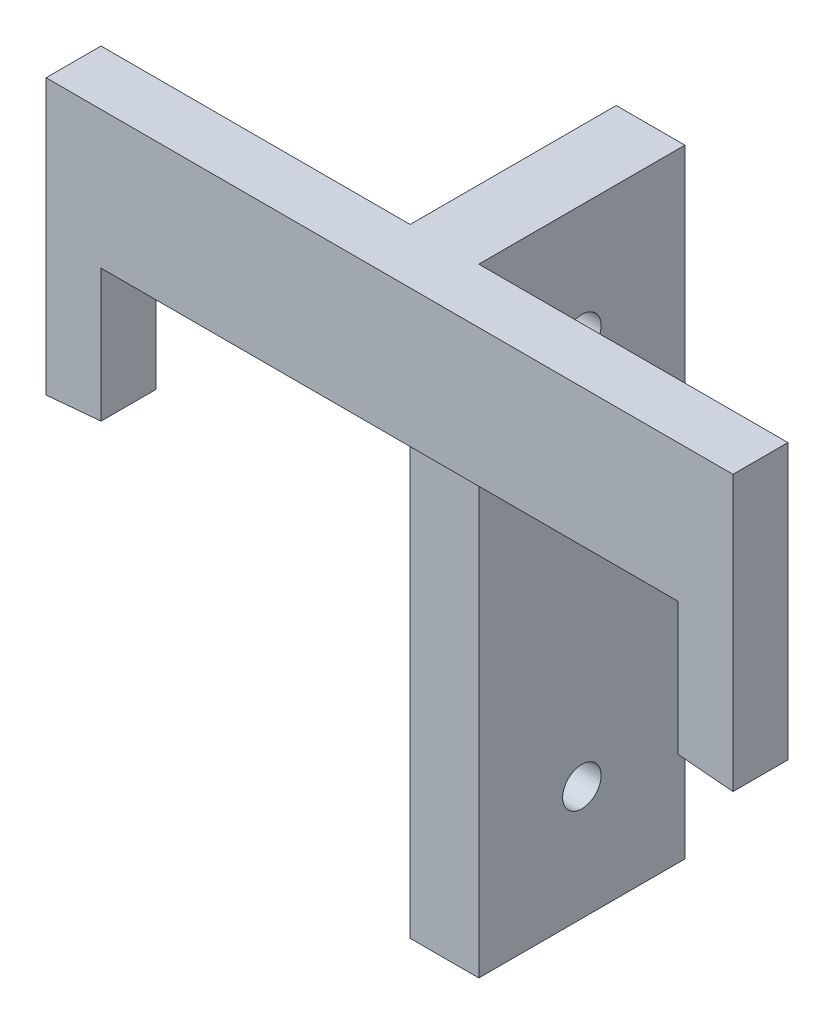
ISO-10303-21;
HEADER;
FILE_DESCRIPTION(('STEP AP214'),'2;1');
FILE_NAME('part.step','',(''),(''),'','','');
FILE_SCHEMA(('AUTOMOTIVE_DESIGN { 1 0 10303 214 1 1 1 1 }'));
ENDSEC;
DATA;
#1=APPLICATION_CONTEXT('core data for automotive mechanical design processes');
#2=APPLICATION_PROTOCOL_DEFINITION('international standard','automotive_design',2000,#1);
#3=PRODUCT_CONTEXT('',#1,'mechanical');
#4=PRODUCT('Part','Part','',(#3));
#5=PRODUCT_RELATED_PRODUCT_CATEGORY('part','',(#4));
#6=PRODUCT_DEFINITION_FORMATION('','',#4);
#7=PRODUCT_DEFINITION_CONTEXT('part definition',#1,'design');
#8=PRODUCT_DEFINITION('design','',#6,#7);
#9=PRODUCT_DEFINITION_SHAPE('','',#8);
#10=(LENGTH_UNIT() NAMED_UNIT(*) SI_UNIT(.MILLI.,.METRE.));
#11=(NAMED_UNIT(*) PLANE_ANGLE_UNIT() SI_UNIT($,.RADIAN.));
#12=(NAMED_UNIT(*) SI_UNIT($,.STERADIAN.) SOLID_ANGLE_UNIT());
#13=UNCERTAINTY_MEASURE_WITH_UNIT(LENGTH_MEASURE(1.E-05),#10,'distance_accuracy_value','');
#14=(GEOMETRIC_REPRESENTATION_CONTEXT(3) GLOBAL_UNCERTAINTY_ASSIGNED_CONTEXT((#13)) GLOBAL_UNIT_ASSIGNED_CONTEXT((#10,
#11,#12)) REPRESENTATION_CONTEXT('',''));
#15=CARTESIAN_POINT('',(0.,0.,0.));
#16=DIRECTION('',(0.,0.,1.));
#17=DIRECTION('',(1.,0.,0.));
#18=AXIS2_PLACEMENT_3D('',#15,#16,#17);
#19=CARTESIAN_POINT('',(1.5875,-14.2875,9.525));
#20=DIRECTION('',(-1.,0.,0.));
#21=DIRECTION('',(0.,0.,1.));
#22=AXIS2_PLACEMENT_3D('',#19,#20,#21);
#23=PLANE('',#22);
#24=CARTESIAN_POINT('',(1.5875,-9.0043,4.7625));
#25=DIRECTION('',(1.,0.,0.));
#26=DIRECTION('',(0.,0.,-1.));
#27=AXIS2_PLACEMENT_3D('',#24,#25,#26);
#28=CIRCLE('',#27,0.889);
#29=CARTESIAN_POINT('',(1.5875,-9.0043,3.8735));
#30=VERTEX_POINT('',#29);
#31=EDGE_CURVE('E108',#30,#30,#28,.T.);
#32=ORIENTED_EDGE('',*,*,#31,.F.);
#33=EDGE_LOOP('',(#32));
#34=FACE_BOUND('',#33,.T.);
#35=CARTESIAN_POINT('',(1.5875,9.0043,4.7625));
#36=DIRECTION('',(1.,0.,0.));
#37=DIRECTION('',(0.,0.,1.));
#38=AXIS2_PLACEMENT_3D('',#35,#36,#37);
#39=CIRCLE('',#38,0.889);
#40=CARTESIAN_POINT('',(1.5875,9.0043,5.6515));
#41=VERTEX_POINT('',#40);
#42=EDGE_CURVE('E184',#41,#41,#39,.T.);
#43=ORIENTED_EDGE('',*,*,#42,.F.);
#44=EDGE_LOOP('',(#43));
#45=FACE_BOUND('',#44,.T.);
#46=DIRECTION('',(0.,1.,0.));
#47=VECTOR('',#46,1.);
#48=CARTESIAN_POINT('',(1.5875,-14.2875,0.));
#49=LINE('',#48,#47);
#50=CARTESIAN_POINT('',(1.5875,-14.2875,0.));
#51=VERTEX_POINT('',#50);
#52=CARTESIAN_POINT('',(1.5875,14.2875,0.));
#53=VERTEX_POINT('',#52);
#54=EDGE_CURVE('E97',#51,#53,#49,.T.);
#55=ORIENTED_EDGE('',*,*,#54,.T.);
#56=DIRECTION('',(0.,0.,-1.));
#57=VECTOR('',#56,1.);
#58=CARTESIAN_POINT('',(1.5875,14.2875,9.525));
#59=LINE('',#58,#57);
#60=CARTESIAN_POINT('',(1.5875,14.2875,9.525));
#61=VERTEX_POINT('',#60);
#62=EDGE_CURVE('E40',#61,#53,#59,.T.);
#63=ORIENTED_EDGE('',*,*,#62,.F.);
#64=DIRECTION('',(0.,1.,0.));
#65=VECTOR('',#64,1.);
#66=CARTESIAN_POINT('',(1.5875,-14.2875,9.525));
#67=LINE('',#66,#65);
#68=CARTESIAN_POINT('',(1.5875,7.9375,9.525));
#69=VERTEX_POINT('',#68);
#70=EDGE_CURVE('E91',#69,#61,#67,.T.);
#71=ORIENTED_EDGE('',*,*,#70,.F.);
#72=CARTESIAN_POINT('',(1.5875,-14.2875,9.525));
#73=VERTEX_POINT('',#72);
#74=EDGE_CURVE('E99',#73,#69,#67,.T.);
#75=ORIENTED_EDGE('',*,*,#74,.F.);
#76=DIRECTION('',(0.,0.,-1.));
#77=VECTOR('',#76,1.);
#78=CARTESIAN_POINT('',(1.5875,-14.2875,9.525));
#79=LINE('',#78,#77);
#80=EDGE_CURVE('E84',#73,#51,#79,.T.);
#81=ORIENTED_EDGE('',*,*,#80,.T.);
#82=EDGE_LOOP('',(#55,#63,#71,#75,#81));
#83=FACE_BOUND('',#82,.T.);
#84=ADVANCED_FACE('F37',(#34,#45,#83),#23,.F.);
#85=CARTESIAN_POINT('',(-1.5875,14.2875,9.525));
#86=DIRECTION('',(0.,-1.,0.));
#87=DIRECTION('',(0.,0.,-1.));
#88=AXIS2_PLACEMENT_3D('',#85,#86,#87);
#89=PLANE('',#88);
#90=DIRECTION('',(-1.,0.,0.));
#91=VECTOR('',#90,1.);
#92=CARTESIAN_POINT('',(-1.5875,14.2875,0.));
#93=LINE('',#92,#91);
#94=CARTESIAN_POINT('',(-1.5875,14.2875,0.));
#95=VERTEX_POINT('',#94);
#96=EDGE_CURVE('E102',#53,#95,#93,.T.);
#97=ORIENTED_EDGE('',*,*,#96,.T.);
#98=DIRECTION('',(0.,0.,-1.));
#99=VECTOR('',#98,1.);
#100=CARTESIAN_POINT('',(-1.5875,14.2875,9.525));
#101=LINE('',#100,#99);
#102=CARTESIAN_POINT('',(-1.5875,14.2875,9.525));
#103=VERTEX_POINT('',#102);
#104=EDGE_CURVE('E114',#103,#95,#101,.T.);
#105=ORIENTED_EDGE('',*,*,#104,.F.);
#106=DIRECTION('',(-1.,0.,0.));
#107=VECTOR('',#106,1.);
#108=CARTESIAN_POINT('',(0.,14.2875,9.525));
#109=LINE('',#108,#107);
#110=CARTESIAN_POINT('',(-15.875,14.2875,9.525));
#111=VERTEX_POINT('',#110);
#112=EDGE_CURVE('E437',#103,#111,#109,.T.);
#113=ORIENTED_EDGE('',*,*,#112,.T.);
#114=DIRECTION('',(0.,0.,-1.));
#115=VECTOR('',#114,1.);
#116=CARTESIAN_POINT('',(-15.875,14.2875,12.065));
#117=LINE('',#116,#115);
#118=CARTESIAN_POINT('',(-15.875,14.2875,12.065));
#119=VERTEX_POINT('',#118);
#120=EDGE_CURVE('E181',#119,#111,#117,.T.);
#121=ORIENTED_EDGE('',*,*,#120,.F.);
#122=DIRECTION('',(-1.,0.,0.));
#123=VECTOR('',#122,1.);
#124=CARTESIAN_POINT('',(0.,14.2875,12.065));
#125=LINE('',#124,#123);
#126=CARTESIAN_POINT('',(15.875,14.2875,12.065));
#127=VERTEX_POINT('',#126);
#128=EDGE_CURVE('E160',#127,#119,#125,.T.);
#129=ORIENTED_EDGE('',*,*,#128,.F.);
#130=DIRECTION('',(0.,0.,-1.));
#131=VECTOR('',#130,1.);
#132=CARTESIAN_POINT('',(15.875,14.2875,12.065));
#133=LINE('',#132,#131);
#134=CARTESIAN_POINT('',(15.875,14.2875,9.525));
#135=VERTEX_POINT('',#134);
#136=EDGE_CURVE('E161',#127,#135,#133,.T.);
#137=ORIENTED_EDGE('',*,*,#136,.T.);
#138=EDGE_CURVE('E125',#135,#61,#109,.T.);
#139=ORIENTED_EDGE('',*,*,#138,.T.);
#140=ORIENTED_EDGE('',*,*,#62,.T.);
#141=EDGE_LOOP('',(#97,#105,#113,#121,#129,#137,#139,#140));
#142=FACE_BOUND('',#141,.T.);
#143=ADVANCED_FACE('F121',(#142),#89,.F.);
#144=CARTESIAN_POINT('',(-1.5875,-14.2875,9.525));
#145=DIRECTION('',(1.,0.,0.));
#146=DIRECTION('',(0.,0.,-1.));
#147=AXIS2_PLACEMENT_3D('',#144,#145,#146);
#148=PLANE('',#147);
#149=CARTESIAN_POINT('',(-1.5875,-9.0043,4.7625));
#150=DIRECTION('',(1.,0.,0.));
#151=DIRECTION('',(0.,0.,-1.));
#152=AXIS2_PLACEMENT_3D('',#149,#150,#151);
#153=CIRCLE('',#152,0.889);
#154=CARTESIAN_POINT('',(-1.5875,-9.0043,3.8735));
#155=VERTEX_POINT('',#154);
#156=EDGE_CURVE('E104',#155,#155,#153,.F.);
#157=ORIENTED_EDGE('',*,*,#156,.F.);
#158=EDGE_LOOP('',(#157));
#159=FACE_BOUND('',#158,.T.);
#160=CARTESIAN_POINT('',(-1.5875,9.0043,4.7625));
#161=DIRECTION('',(1.,0.,0.));
#162=DIRECTION('',(0.,0.,-1.));
#163=AXIS2_PLACEMENT_3D('',#160,#161,#162);
#164=CIRCLE('',#163,0.889);
#165=CARTESIAN_POINT('',(-1.5875,9.0043,3.8735));
#166=VERTEX_POINT('',#165);
#167=EDGE_CURVE('E186',#166,#166,#164,.F.);
#168=ORIENTED_EDGE('',*,*,#167,.F.);
#169=EDGE_LOOP('',(#168));
#170=FACE_BOUND('',#169,.T.);
#171=DIRECTION('',(0.,-1.,0.));
#172=VECTOR('',#171,1.);
#173=CARTESIAN_POINT('',(-1.5875,-14.2875,0.));
#174=LINE('',#173,#172);
#175=CARTESIAN_POINT('',(-1.5875,-14.2875,0.));
#176=VERTEX_POINT('',#175);
#177=EDGE_CURVE('E92',#95,#176,#174,.T.);
#178=ORIENTED_EDGE('',*,*,#177,.T.);
#179=DIRECTION('',(0.,0.,-1.));
#180=VECTOR('',#179,1.);
#181=CARTESIAN_POINT('',(-1.5875,-14.2875,9.525));
#182=LINE('',#181,#180);
#183=CARTESIAN_POINT('',(-1.5875,-14.2875,9.525));
#184=VERTEX_POINT('',#183);
#185=EDGE_CURVE('E87',#184,#176,#182,.T.);
#186=ORIENTED_EDGE('',*,*,#185,.F.);
#187=DIRECTION('',(0.,-1.,0.));
#188=VECTOR('',#187,1.);
#189=CARTESIAN_POINT('',(-1.5875,-14.2875,9.525));
#190=LINE('',#189,#188);
#191=CARTESIAN_POINT('',(-1.5875,7.9375,9.525));
#192=VERTEX_POINT('',#191);
#193=EDGE_CURVE('E192',#192,#184,#190,.T.);
#194=ORIENTED_EDGE('',*,*,#193,.F.);
#195=EDGE_CURVE('E193',#103,#192,#190,.T.);
#196=ORIENTED_EDGE('',*,*,#195,.F.);
#197=ORIENTED_EDGE('',*,*,#104,.T.);
#198=EDGE_LOOP('',(#178,#186,#194,#196,#197));
#199=FACE_BOUND('',#198,.T.);
#200=ADVANCED_FACE('F196',(#159,#170,#199),#148,.F.);
#201=CARTESIAN_POINT('',(-1.5875,-14.2875,9.525));
#202=DIRECTION('',(0.,1.,0.));
#203=DIRECTION('',(0.,0.,1.));
#204=AXIS2_PLACEMENT_3D('',#201,#202,#203);
#205=PLANE('',#204);
#206=DIRECTION('',(1.,0.,0.));
#207=VECTOR('',#206,1.);
#208=CARTESIAN_POINT('',(-1.5875,-14.2875,0.));
#209=LINE('',#208,#207);
#210=EDGE_CURVE('E81',#176,#51,#209,.T.);
#211=ORIENTED_EDGE('',*,*,#210,.T.);
#212=ORIENTED_EDGE('',*,*,#80,.F.);
#213=DIRECTION('',(1.,0.,0.));
#214=VECTOR('',#213,1.);
#215=CARTESIAN_POINT('',(-1.5875,-14.2875,9.525));
#216=LINE('',#215,#214);
#217=EDGE_CURVE('E62',#184,#73,#216,.T.);
#218=ORIENTED_EDGE('',*,*,#217,.F.);
#219=ORIENTED_EDGE('',*,*,#185,.T.);
#220=EDGE_LOOP('',(#211,#212,#218,#219));
#221=FACE_BOUND('',#220,.T.);
#222=ADVANCED_FACE('F83',(#221),#205,.F.);
#223=CARTESIAN_POINT('',(0.,0.,9.525));
#224=DIRECTION('',(0.,0.,-1.));
#225=DIRECTION('',(-1.,0.,0.));
#226=AXIS2_PLACEMENT_3D('',#223,#224,#225);
#227=PLANE('',#226);
#228=ORIENTED_EDGE('',*,*,#74,.T.);
#229=DIRECTION('',(-1.,0.,0.));
#230=VECTOR('',#229,1.);
#231=CARTESIAN_POINT('',(0.,7.9375,9.525));
#232=LINE('',#231,#230);
#233=EDGE_CURVE('E11',#69,#192,#232,.T.);
#234=ORIENTED_EDGE('',*,*,#233,.T.);
#235=ORIENTED_EDGE('',*,*,#193,.T.);
#236=ORIENTED_EDGE('',*,*,#217,.T.);
#237=EDGE_LOOP('',(#228,#234,#235,#236));
#238=FACE_BOUND('',#237,.T.);
#239=ADVANCED_FACE('F195',(#238),#227,.F.);
#240=CARTESIAN_POINT('',(0.,0.,0.));
#241=DIRECTION('',(0.,0.,-1.));
#242=DIRECTION('',(-1.,0.,0.));
#243=AXIS2_PLACEMENT_3D('',#240,#241,#242);
#244=PLANE('',#243);
#245=ORIENTED_EDGE('',*,*,#54,.F.);
#246=ORIENTED_EDGE('',*,*,#210,.F.);
#247=ORIENTED_EDGE('',*,*,#177,.F.);
#248=ORIENTED_EDGE('',*,*,#96,.F.);
#249=EDGE_LOOP('',(#245,#246,#247,#248));
#250=FACE_BOUND('',#249,.T.);
#251=ADVANCED_FACE('F101',(#250),#244,.T.);
#252=CARTESIAN_POINT('',(-1.5885,9.0043,4.7625));
#253=DIRECTION('',(1.,0.,0.));
#254=DIRECTION('',(0.,0.,-1.));
#255=AXIS2_PLACEMENT_3D('',#252,#253,#254);
#256=CYLINDRICAL_SURFACE('',#255,0.889);
#257=ORIENTED_EDGE('',*,*,#42,.T.);
#258=EDGE_LOOP('',(#257));
#259=FACE_BOUND('',#258,.T.);
#260=ORIENTED_EDGE('',*,*,#167,.T.);
#261=EDGE_LOOP('',(#260));
#262=FACE_BOUND('',#261,.T.);
#263=ADVANCED_FACE('F215',(#259,#262),#256,.F.);
#264=CARTESIAN_POINT('',(-1.5885,-9.0043,4.7625));
#265=DIRECTION('',(1.,0.,0.));
#266=DIRECTION('',(0.,0.,-1.));
#267=AXIS2_PLACEMENT_3D('',#264,#265,#266);
#268=CYLINDRICAL_SURFACE('',#267,0.889);
#269=ORIENTED_EDGE('',*,*,#31,.T.);
#270=EDGE_LOOP('',(#269));
#271=FACE_BOUND('',#270,.T.);
#272=ORIENTED_EDGE('',*,*,#156,.T.);
#273=EDGE_LOOP('',(#272));
#274=FACE_BOUND('',#273,.T.);
#275=ADVANCED_FACE('F218',(#271,#274),#268,.F.);
#276=CARTESIAN_POINT('',(0.,0.,9.525));
#277=DIRECTION('',(0.,0.,1.));
#278=DIRECTION('',(1.,0.,0.));
#279=AXIS2_PLACEMENT_3D('',#276,#277,#278);
#280=PLANE('',#279);
#281=CARTESIAN_POINT('',(13.335,7.9375,9.525));
#282=VERTEX_POINT('',#281);
#283=EDGE_CURVE('E46',#282,#69,#232,.T.);
#284=ORIENTED_EDGE('',*,*,#283,.T.);
#285=ORIENTED_EDGE('',*,*,#70,.T.);
#286=ORIENTED_EDGE('',*,*,#138,.F.);
#287=DIRECTION('',(0.,-1.,0.));
#288=VECTOR('',#287,1.);
#289=CARTESIAN_POINT('',(15.875,0.,9.525));
#290=LINE('',#289,#288);
#291=CARTESIAN_POINT('',(15.875,1.5875,9.525));
#292=VERTEX_POINT('',#291);
#293=EDGE_CURVE('E157',#135,#292,#290,.T.);
#294=ORIENTED_EDGE('',*,*,#293,.T.);
#295=DIRECTION('',(-0.996194698091745,0.087155742747662,0.));
#296=VECTOR('',#295,1.);
#297=CARTESIAN_POINT('',(0.258421701488741,2.95377356418476,9.525));
#298=LINE('',#297,#296);
#299=CARTESIAN_POINT('',(13.335,1.80972120535586,9.525));
#300=VERTEX_POINT('',#299);
#301=EDGE_CURVE('E150',#292,#300,#298,.T.);
#302=ORIENTED_EDGE('',*,*,#301,.T.);
#303=DIRECTION('',(0.,1.,0.));
#304=VECTOR('',#303,1.);
#305=CARTESIAN_POINT('',(13.335,0.,9.525));
#306=LINE('',#305,#304);
#307=EDGE_CURVE('E149',#300,#282,#306,.T.);
#308=ORIENTED_EDGE('',*,*,#307,.T.);
#309=EDGE_LOOP('',(#284,#285,#286,#294,#302,#308));
#310=FACE_BOUND('',#309,.T.);
#311=ADVANCED_FACE('F146',(#310),#280,.F.);
#312=ORIENTED_EDGE('',*,*,#112,.F.);
#313=ORIENTED_EDGE('',*,*,#195,.T.);
#314=CARTESIAN_POINT('',(-13.335,7.9375,9.525));
#315=VERTEX_POINT('',#314);
#316=EDGE_CURVE('E47',#192,#315,#232,.T.);
#317=ORIENTED_EDGE('',*,*,#316,.T.);
#318=DIRECTION('',(0.,1.,0.));
#319=VECTOR('',#318,1.);
#320=CARTESIAN_POINT('',(-13.335,0.,9.525));
#321=LINE('',#320,#319);
#322=CARTESIAN_POINT('',(-13.335,1.80972120535586,9.525));
#323=VERTEX_POINT('',#322);
#324=EDGE_CURVE('E152',#323,#315,#321,.T.);
#325=ORIENTED_EDGE('',*,*,#324,.F.);
#326=DIRECTION('',(0.996194698091745,0.087155742747662,0.));
#327=VECTOR('',#326,1.);
#328=CARTESIAN_POINT('',(-0.258421701488741,2.95377356418476,9.525));
#329=LINE('',#328,#327);
#330=CARTESIAN_POINT('',(-15.875,1.5875,9.525));
#331=VERTEX_POINT('',#330);
#332=EDGE_CURVE('E458',#331,#323,#329,.T.);
#333=ORIENTED_EDGE('',*,*,#332,.F.);
#334=DIRECTION('',(0.,-1.,0.));
#335=VECTOR('',#334,1.);
#336=CARTESIAN_POINT('',(-15.875,0.,9.525));
#337=LINE('',#336,#335);
#338=EDGE_CURVE('E441',#111,#331,#337,.T.);
#339=ORIENTED_EDGE('',*,*,#338,.F.);
#340=EDGE_LOOP('',(#312,#313,#317,#325,#333,#339));
#341=FACE_BOUND('',#340,.T.);
#342=ADVANCED_FACE('F285',(#341),#280,.F.);
#343=CARTESIAN_POINT('',(-15.875,0.,12.065));
#344=DIRECTION('',(1.,0.,0.));
#345=DIRECTION('',(0.,0.,-1.));
#346=AXIS2_PLACEMENT_3D('',#343,#344,#345);
#347=PLANE('',#346);
#348=ORIENTED_EDGE('',*,*,#338,.T.);
#349=DIRECTION('',(0.,0.,-1.));
#350=VECTOR('',#349,1.);
#351=CARTESIAN_POINT('',(-15.875,1.5875,12.065));
#352=LINE('',#351,#350);
#353=CARTESIAN_POINT('',(-15.875,1.5875,12.065));
#354=VERTEX_POINT('',#353);
#355=EDGE_CURVE('E178',#354,#331,#352,.T.);
#356=ORIENTED_EDGE('',*,*,#355,.F.);
#357=DIRECTION('',(0.,-1.,0.));
#358=VECTOR('',#357,1.);
#359=CARTESIAN_POINT('',(-15.875,0.,12.065));
#360=LINE('',#359,#358);
#361=EDGE_CURVE('E429',#119,#354,#360,.T.);
#362=ORIENTED_EDGE('',*,*,#361,.F.);
#363=ORIENTED_EDGE('',*,*,#120,.T.);
#364=EDGE_LOOP('',(#348,#356,#362,#363));
#365=FACE_BOUND('',#364,.T.);
#366=ADVANCED_FACE('F305',(#365),#347,.F.);
#367=CARTESIAN_POINT('',(-0.258421701488741,2.95377356418476,12.065));
#368=DIRECTION('',(-0.087155742747662,0.996194698091745,0.));
#369=DIRECTION('',(-0.996194698091745,-0.087155742747662,0.));
#370=AXIS2_PLACEMENT_3D('',#367,#368,#369);
#371=PLANE('',#370);
#372=ORIENTED_EDGE('',*,*,#332,.T.);
#373=DIRECTION('',(0.,0.,-1.));
#374=VECTOR('',#373,1.);
#375=CARTESIAN_POINT('',(-13.335,1.80972120535586,12.065));
#376=LINE('',#375,#374);
#377=CARTESIAN_POINT('',(-13.335,1.80972120535586,12.065));
#378=VERTEX_POINT('',#377);
#379=EDGE_CURVE('E175',#378,#323,#376,.T.);
#380=ORIENTED_EDGE('',*,*,#379,.F.);
#381=DIRECTION('',(0.996194698091745,0.087155742747662,0.));
#382=VECTOR('',#381,1.);
#383=CARTESIAN_POINT('',(-0.258421701488741,2.95377356418476,12.065));
#384=LINE('',#383,#382);
#385=EDGE_CURVE('E483',#354,#378,#384,.T.);
#386=ORIENTED_EDGE('',*,*,#385,.F.);
#387=ORIENTED_EDGE('',*,*,#355,.T.);
#388=EDGE_LOOP('',(#372,#380,#386,#387));
#389=FACE_BOUND('',#388,.T.);
#390=ADVANCED_FACE('F324',(#389),#371,.F.);
#391=CARTESIAN_POINT('',(-13.335,0.,12.065));
#392=DIRECTION('',(-1.,0.,0.));
#393=DIRECTION('',(0.,0.,1.));
#394=AXIS2_PLACEMENT_3D('',#391,#392,#393);
#395=PLANE('',#394);
#396=ORIENTED_EDGE('',*,*,#324,.T.);
#397=DIRECTION('',(0.,0.,-1.));
#398=VECTOR('',#397,1.);
#399=CARTESIAN_POINT('',(-13.335,7.9375,12.065));
#400=LINE('',#399,#398);
#401=CARTESIAN_POINT('',(-13.335,7.9375,12.065));
#402=VERTEX_POINT('',#401);
#403=EDGE_CURVE('E173',#402,#315,#400,.T.);
#404=ORIENTED_EDGE('',*,*,#403,.F.);
#405=DIRECTION('',(0.,1.,0.));
#406=VECTOR('',#405,1.);
#407=CARTESIAN_POINT('',(-13.335,0.,12.065));
#408=LINE('',#407,#406);
#409=EDGE_CURVE('E479',#378,#402,#408,.T.);
#410=ORIENTED_EDGE('',*,*,#409,.F.);
#411=ORIENTED_EDGE('',*,*,#379,.T.);
#412=EDGE_LOOP('',(#396,#404,#410,#411));
#413=FACE_BOUND('',#412,.T.);
#414=ADVANCED_FACE('F335',(#413),#395,.F.);
#415=CARTESIAN_POINT('',(0.,7.9375,12.065));
#416=DIRECTION('',(0.,-1.,0.));
#417=DIRECTION('',(1.,0.,0.));
#418=AXIS2_PLACEMENT_3D('',#415,#416,#417);
#419=PLANE('',#418);
#420=ORIENTED_EDGE('',*,*,#283,.F.);
#421=DIRECTION('',(0.,0.,-1.));
#422=VECTOR('',#421,1.);
#423=CARTESIAN_POINT('',(13.335,7.9375,12.065));
#424=LINE('',#423,#422);
#425=CARTESIAN_POINT('',(13.335,7.9375,12.065));
#426=VERTEX_POINT('',#425);
#427=EDGE_CURVE('E170',#426,#282,#424,.T.);
#428=ORIENTED_EDGE('',*,*,#427,.F.);
#429=DIRECTION('',(-1.,0.,0.));
#430=VECTOR('',#429,1.);
#431=CARTESIAN_POINT('',(0.,7.9375,12.065));
#432=LINE('',#431,#430);
#433=EDGE_CURVE('E471',#426,#402,#432,.T.);
#434=ORIENTED_EDGE('',*,*,#433,.T.);
#435=ORIENTED_EDGE('',*,*,#403,.T.);
#436=ORIENTED_EDGE('',*,*,#316,.F.);
#437=ORIENTED_EDGE('',*,*,#233,.F.);
#438=EDGE_LOOP('',(#420,#428,#434,#435,#436,#437));
#439=FACE_BOUND('',#438,.T.);
#440=ADVANCED_FACE('F141',(#439),#419,.T.);
#441=CARTESIAN_POINT('',(13.335,0.,12.065));
#442=DIRECTION('',(-1.,0.,0.));
#443=DIRECTION('',(0.,0.,1.));
#444=AXIS2_PLACEMENT_3D('',#441,#442,#443);
#445=PLANE('',#444);
#446=ORIENTED_EDGE('',*,*,#307,.F.);
#447=DIRECTION('',(0.,0.,-1.));
#448=VECTOR('',#447,1.);
#449=CARTESIAN_POINT('',(13.335,1.80972120535586,12.065));
#450=LINE('',#449,#448);
#451=CARTESIAN_POINT('',(13.335,1.80972120535586,12.065));
#452=VERTEX_POINT('',#451);
#453=EDGE_CURVE('E167',#452,#300,#450,.T.);
#454=ORIENTED_EDGE('',*,*,#453,.F.);
#455=DIRECTION('',(0.,1.,0.));
#456=VECTOR('',#455,1.);
#457=CARTESIAN_POINT('',(13.335,0.,12.065));
#458=LINE('',#457,#456);
#459=EDGE_CURVE('E478',#452,#426,#458,.T.);
#460=ORIENTED_EDGE('',*,*,#459,.T.);
#461=ORIENTED_EDGE('',*,*,#427,.T.);
#462=EDGE_LOOP('',(#446,#454,#460,#461));
#463=FACE_BOUND('',#462,.T.);
#464=ADVANCED_FACE('F352',(#463),#445,.T.);
#465=CARTESIAN_POINT('',(0.258421701488741,2.95377356418476,12.065));
#466=DIRECTION('',(-0.087155742747662,-0.996194698091745,0.));
#467=DIRECTION('',(0.996194698091745,-0.087155742747662,0.));
#468=AXIS2_PLACEMENT_3D('',#465,#466,#467);
#469=PLANE('',#468);
#470=ORIENTED_EDGE('',*,*,#301,.F.);
#471=DIRECTION('',(0.,0.,-1.));
#472=VECTOR('',#471,1.);
#473=CARTESIAN_POINT('',(15.875,1.5875,12.065));
#474=LINE('',#473,#472);
#475=CARTESIAN_POINT('',(15.875,1.5875,12.065));
#476=VERTEX_POINT('',#475);
#477=EDGE_CURVE('E163',#476,#292,#474,.T.);
#478=ORIENTED_EDGE('',*,*,#477,.F.);
#479=DIRECTION('',(-0.996194698091745,0.087155742747662,0.));
#480=VECTOR('',#479,1.);
#481=CARTESIAN_POINT('',(0.258421701488741,2.95377356418476,12.065));
#482=LINE('',#481,#480);
#483=EDGE_CURVE('E481',#476,#452,#482,.T.);
#484=ORIENTED_EDGE('',*,*,#483,.T.);
#485=ORIENTED_EDGE('',*,*,#453,.T.);
#486=EDGE_LOOP('',(#470,#478,#484,#485));
#487=FACE_BOUND('',#486,.T.);
#488=ADVANCED_FACE('F366',(#487),#469,.T.);
#489=CARTESIAN_POINT('',(15.875,0.,12.065));
#490=DIRECTION('',(1.,0.,0.));
#491=DIRECTION('',(0.,0.,-1.));
#492=AXIS2_PLACEMENT_3D('',#489,#490,#491);
#493=PLANE('',#492);
#494=ORIENTED_EDGE('',*,*,#293,.F.);
#495=ORIENTED_EDGE('',*,*,#136,.F.);
#496=DIRECTION('',(0.,-1.,0.));
#497=VECTOR('',#496,1.);
#498=CARTESIAN_POINT('',(15.875,0.,12.065));
#499=LINE('',#498,#497);
#500=EDGE_CURVE('E164',#127,#476,#499,.T.);
#501=ORIENTED_EDGE('',*,*,#500,.T.);
#502=ORIENTED_EDGE('',*,*,#477,.T.);
#503=EDGE_LOOP('',(#494,#495,#501,#502));
#504=FACE_BOUND('',#503,.T.);
#505=ADVANCED_FACE('F375',(#504),#493,.T.);
#506=CARTESIAN_POINT('',(0.,0.,12.065));
#507=DIRECTION('',(0.,0.,1.));
#508=DIRECTION('',(1.,0.,0.));
#509=AXIS2_PLACEMENT_3D('',#506,#507,#508);
#510=PLANE('',#509);
#511=ORIENTED_EDGE('',*,*,#128,.T.);
#512=ORIENTED_EDGE('',*,*,#361,.T.);
#513=ORIENTED_EDGE('',*,*,#385,.T.);
#514=ORIENTED_EDGE('',*,*,#409,.T.);
#515=ORIENTED_EDGE('',*,*,#433,.F.);
#516=ORIENTED_EDGE('',*,*,#459,.F.);
#517=ORIENTED_EDGE('',*,*,#483,.F.);
#518=ORIENTED_EDGE('',*,*,#500,.F.);
#519=EDGE_LOOP('',(#511,#512,#513,#514,#515,#516,#517,#518));
#520=FACE_BOUND('',#519,.T.);
#521=ADVANCED_FACE('F384',(#520),#510,.T.);
#522=CLOSED_SHELL('',(#84,#143,#200,#222,#239,#251,#263,#275,#311,#342,#366,#390,#414,#440,#464,
#488,#505,#521));
#523=MANIFOLD_SOLID_BREP('B2',#522);
#524=ADVANCED_BREP_SHAPE_REPRESENTATION('',(#18,#523),#14);
#525=SHAPE_DEFINITION_REPRESENTATION(#9,#524);
ENDSEC;
END-ISO-10303-21;
